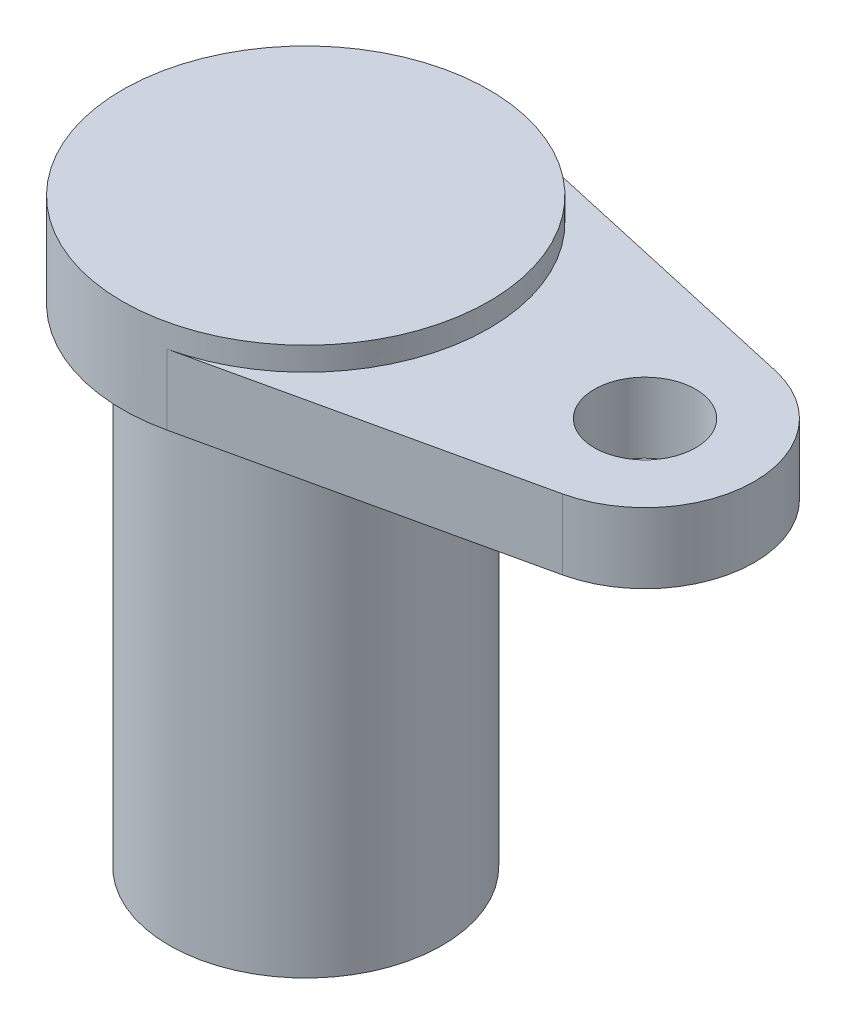
ISO-10303-21;
HEADER;
FILE_DESCRIPTION(('STEP AP214'),'2;1');
FILE_NAME('part.step','',(''),(''),'','','');
FILE_SCHEMA(('AUTOMOTIVE_DESIGN { 1 0 10303 214 1 1 1 1 }'));
ENDSEC;
DATA;
#1=APPLICATION_CONTEXT('core data for automotive mechanical design processes');
#2=APPLICATION_PROTOCOL_DEFINITION('international standard','automotive_design',2000,#1);
#3=PRODUCT_CONTEXT('',#1,'mechanical');
#4=PRODUCT('Part','Part','',(#3));
#5=PRODUCT_RELATED_PRODUCT_CATEGORY('part','',(#4));
#6=PRODUCT_DEFINITION_FORMATION('','',#4);
#7=PRODUCT_DEFINITION_CONTEXT('part definition',#1,'design');
#8=PRODUCT_DEFINITION('design','',#6,#7);
#9=PRODUCT_DEFINITION_SHAPE('','',#8);
#10=(LENGTH_UNIT() NAMED_UNIT(*) SI_UNIT(.MILLI.,.METRE.));
#11=(NAMED_UNIT(*) PLANE_ANGLE_UNIT() SI_UNIT($,.RADIAN.));
#12=(NAMED_UNIT(*) SI_UNIT($,.STERADIAN.) SOLID_ANGLE_UNIT());
#13=UNCERTAINTY_MEASURE_WITH_UNIT(LENGTH_MEASURE(1.E-05),#10,'distance_accuracy_value','');
#14=(GEOMETRIC_REPRESENTATION_CONTEXT(3) GLOBAL_UNCERTAINTY_ASSIGNED_CONTEXT((#13)) GLOBAL_UNIT_ASSIGNED_CONTEXT((#10,
#11,#12)) REPRESENTATION_CONTEXT('',''));
#15=CARTESIAN_POINT('',(0.,0.,0.));
#16=DIRECTION('',(0.,0.,1.));
#17=DIRECTION('',(1.,0.,0.));
#18=AXIS2_PLACEMENT_3D('',#15,#16,#17);
#19=CARTESIAN_POINT('',(0.,31.75,0.));
#20=DIRECTION('',(0.,-1.,0.));
#21=DIRECTION('',(0.,0.,-1.));
#22=AXIS2_PLACEMENT_3D('',#19,#20,#21);
#23=CYLINDRICAL_SURFACE('',#22,8.89);
#24=CARTESIAN_POINT('',(0.,31.75,0.));
#25=DIRECTION('',(0.,1.,0.));
#26=DIRECTION('',(0.,0.,1.));
#27=AXIS2_PLACEMENT_3D('',#24,#25,#26);
#28=CIRCLE('',#27,8.89);
#29=CARTESIAN_POINT('',(0.,31.75,8.89));
#30=VERTEX_POINT('',#29);
#31=EDGE_CURVE('E11',#30,#30,#28,.T.);
#32=ORIENTED_EDGE('',*,*,#31,.F.);
#33=EDGE_LOOP('',(#32));
#34=FACE_BOUND('',#33,.T.);
#35=CARTESIAN_POINT('',(0.,0.,0.));
#36=DIRECTION('',(0.,1.,0.));
#37=DIRECTION('',(0.,0.,1.));
#38=AXIS2_PLACEMENT_3D('',#35,#36,#37);
#39=CIRCLE('',#38,8.89);
#40=CARTESIAN_POINT('',(0.,0.,8.89));
#41=VERTEX_POINT('',#40);
#42=EDGE_CURVE('E52',#41,#41,#39,.T.);
#43=ORIENTED_EDGE('',*,*,#42,.T.);
#44=EDGE_LOOP('',(#43));
#45=FACE_BOUND('',#44,.T.);
#46=ADVANCED_FACE('F49',(#34,#45),#23,.T.);
#47=CARTESIAN_POINT('',(0.,0.,0.));
#48=DIRECTION('',(0.,1.,0.));
#49=DIRECTION('',(0.,0.,1.));
#50=AXIS2_PLACEMENT_3D('',#47,#48,#49);
#51=PLANE('',#50);
#52=ORIENTED_EDGE('',*,*,#42,.F.);
#53=EDGE_LOOP('',(#52));
#54=FACE_BOUND('',#53,.T.);
#55=ADVANCED_FACE('F179',(#54),#51,.F.);
#56=CARTESIAN_POINT('',(0.,36.322,0.));
#57=DIRECTION('',(0.,1.,0.));
#58=DIRECTION('',(0.,0.,1.));
#59=AXIS2_PLACEMENT_3D('',#56,#57,#58);
#60=PLANE('',#59);
#61=CARTESIAN_POINT('',(0.,36.322,0.));
#62=DIRECTION('',(0.,1.,0.));
#63=DIRECTION('',(0.,0.,1.));
#64=AXIS2_PLACEMENT_3D('',#61,#62,#63);
#65=CIRCLE('',#64,11.938);
#66=CARTESIAN_POINT('',(2.60714942528735,36.322,11.6498332981302));
#67=VERTEX_POINT('',#66);
#68=CARTESIAN_POINT('',(2.60714942528735,36.322,-11.6498332981302));
#69=VERTEX_POINT('',#68);
#70=EDGE_CURVE('E104',#67,#69,#65,.T.);
#71=ORIENTED_EDGE('',*,*,#70,.F.);
#72=DIRECTION('',(0.975861392036374,0.,-0.218390804597701));
#73=VECTOR('',#72,1.);
#74=CARTESIAN_POINT('',(23.6511954022988,36.322,6.94032622016269));
#75=LINE('',#74,#73);
#76=CARTESIAN_POINT('',(23.6511954022988,36.322,6.94032622016269));
#77=VERTEX_POINT('',#76);
#78=EDGE_CURVE('E93',#67,#77,#75,.T.);
#79=ORIENTED_EDGE('',*,*,#78,.T.);
#80=CARTESIAN_POINT('',(22.098,36.322,0.));
#81=DIRECTION('',(0.,1.,0.));
#82=DIRECTION('',(0.,0.,-1.));
#83=AXIS2_PLACEMENT_3D('',#80,#81,#82);
#84=CIRCLE('',#83,7.11200000000001);
#85=CARTESIAN_POINT('',(23.6511954022988,36.322,-6.9403262201627));
#86=VERTEX_POINT('',#85);
#87=EDGE_CURVE('E114',#77,#86,#84,.T.);
#88=ORIENTED_EDGE('',*,*,#87,.T.);
#89=DIRECTION('',(-0.975861392036374,0.,-0.218390804597701));
#90=VECTOR('',#89,1.);
#91=CARTESIAN_POINT('',(2.60714942528735,36.322,-11.6498332981302));
#92=LINE('',#91,#90);
#93=EDGE_CURVE('E66',#86,#69,#92,.T.);
#94=ORIENTED_EDGE('',*,*,#93,.T.);
#95=EDGE_LOOP('',(#71,#79,#88,#94));
#96=FACE_BOUND('',#95,.T.);
#97=CARTESIAN_POINT('',(22.098,36.322,0.));
#98=DIRECTION('',(0.,1.,0.));
#99=DIRECTION('',(0.,0.,1.));
#100=AXIS2_PLACEMENT_3D('',#97,#98,#99);
#101=CIRCLE('',#100,3.302);
#102=CARTESIAN_POINT('',(22.098,36.322,3.302));
#103=VERTEX_POINT('',#102);
#104=EDGE_CURVE('E126',#103,#103,#101,.T.);
#105=ORIENTED_EDGE('',*,*,#104,.F.);
#106=EDGE_LOOP('',(#105));
#107=FACE_BOUND('',#106,.T.);
#108=ADVANCED_FACE('F116',(#96,#107),#60,.T.);
#109=CARTESIAN_POINT('',(0.,31.75,0.));
#110=DIRECTION('',(0.,1.,0.));
#111=DIRECTION('',(0.,0.,1.));
#112=AXIS2_PLACEMENT_3D('',#109,#110,#111);
#113=PLANE('',#112);
#114=ORIENTED_EDGE('',*,*,#31,.T.);
#115=EDGE_LOOP('',(#114));
#116=FACE_BOUND('',#115,.T.);
#117=CARTESIAN_POINT('',(0.,31.75,0.));
#118=DIRECTION('',(0.,1.,0.));
#119=DIRECTION('',(0.,0.,1.));
#120=AXIS2_PLACEMENT_3D('',#117,#118,#119);
#121=CIRCLE('',#120,11.938);
#122=CARTESIAN_POINT('',(2.60714942528735,31.75,-11.6498332981302));
#123=VERTEX_POINT('',#122);
#124=CARTESIAN_POINT('',(2.60714942528735,31.75,11.6498332981302));
#125=VERTEX_POINT('',#124);
#126=EDGE_CURVE('E106',#123,#125,#121,.T.);
#127=ORIENTED_EDGE('',*,*,#126,.F.);
#128=DIRECTION('',(-0.975861392036374,0.,-0.218390804597701));
#129=VECTOR('',#128,1.);
#130=CARTESIAN_POINT('',(2.60714942528735,31.75,-11.6498332981302));
#131=LINE('',#130,#129);
#132=CARTESIAN_POINT('',(23.6511954022988,31.75,-6.9403262201627));
#133=VERTEX_POINT('',#132);
#134=EDGE_CURVE('E89',#133,#123,#131,.T.);
#135=ORIENTED_EDGE('',*,*,#134,.F.);
#136=CARTESIAN_POINT('',(22.098,31.75,0.));
#137=DIRECTION('',(0.,1.,0.));
#138=DIRECTION('',(0.,0.,-1.));
#139=AXIS2_PLACEMENT_3D('',#136,#137,#138);
#140=CIRCLE('',#139,7.11200000000001);
#141=CARTESIAN_POINT('',(23.6511954022988,31.75,6.94032622016269));
#142=VERTEX_POINT('',#141);
#143=EDGE_CURVE('E84',#142,#133,#140,.T.);
#144=ORIENTED_EDGE('',*,*,#143,.F.);
#145=DIRECTION('',(0.975861392036374,0.,-0.218390804597701));
#146=VECTOR('',#145,1.);
#147=CARTESIAN_POINT('',(23.6511954022988,31.75,6.94032622016269));
#148=LINE('',#147,#146);
#149=EDGE_CURVE('E140',#125,#142,#148,.T.);
#150=ORIENTED_EDGE('',*,*,#149,.F.);
#151=EDGE_LOOP('',(#127,#135,#144,#150));
#152=FACE_BOUND('',#151,.T.);
#153=CARTESIAN_POINT('',(22.098,31.75,0.));
#154=DIRECTION('',(0.,1.,0.));
#155=DIRECTION('',(0.,0.,1.));
#156=AXIS2_PLACEMENT_3D('',#153,#154,#155);
#157=CIRCLE('',#156,3.302);
#158=CARTESIAN_POINT('',(22.098,31.75,3.302));
#159=VERTEX_POINT('',#158);
#160=EDGE_CURVE('E123',#159,#159,#157,.T.);
#161=ORIENTED_EDGE('',*,*,#160,.T.);
#162=EDGE_LOOP('',(#161));
#163=FACE_BOUND('',#162,.T.);
#164=ADVANCED_FACE('F155',(#116,#152,#163),#113,.F.);
#165=CARTESIAN_POINT('',(0.,36.322,0.));
#166=DIRECTION('',(0.,-1.,0.));
#167=DIRECTION('',(0.,0.,-1.));
#168=AXIS2_PLACEMENT_3D('',#165,#166,#167);
#169=CYLINDRICAL_SURFACE('',#168,11.938);
#170=ORIENTED_EDGE('',*,*,#126,.T.);
#171=DIRECTION('',(0.,-1.,0.));
#172=VECTOR('',#171,1.);
#173=CARTESIAN_POINT('',(2.60714942528735,36.322,11.6498332981302));
#174=LINE('',#173,#172);
#175=EDGE_CURVE('E101',#67,#125,#174,.T.);
#176=ORIENTED_EDGE('',*,*,#175,.F.);
#177=ORIENTED_EDGE('',*,*,#70,.T.);
#178=DIRECTION('',(0.,-1.,0.));
#179=VECTOR('',#178,1.);
#180=CARTESIAN_POINT('',(2.60714942528735,36.322,-11.6498332981302));
#181=LINE('',#180,#179);
#182=EDGE_CURVE('E137',#69,#123,#181,.T.);
#183=ORIENTED_EDGE('',*,*,#182,.T.);
#184=EDGE_LOOP('',(#170,#176,#177,#183));
#185=FACE_BOUND('',#184,.T.);
#186=CARTESIAN_POINT('',(0.,37.846,0.));
#187=DIRECTION('',(0.,1.,0.));
#188=DIRECTION('',(0.,0.,1.));
#189=AXIS2_PLACEMENT_3D('',#186,#187,#188);
#190=CIRCLE('',#189,11.938);
#191=CARTESIAN_POINT('',(0.,37.846,11.938));
#192=VERTEX_POINT('',#191);
#193=EDGE_CURVE('E119',#192,#192,#190,.T.);
#194=ORIENTED_EDGE('',*,*,#193,.F.);
#195=EDGE_LOOP('',(#194));
#196=FACE_BOUND('',#195,.T.);
#197=ADVANCED_FACE('F102',(#185,#196),#169,.T.);
#198=CARTESIAN_POINT('',(23.6511954022988,36.322,6.94032622016269));
#199=DIRECTION('',(-0.218390804597701,0.,-0.975861392036374));
#200=DIRECTION('',(-0.975861392036374,0.,0.218390804597701));
#201=AXIS2_PLACEMENT_3D('',#198,#199,#200);
#202=PLANE('',#201);
#203=ORIENTED_EDGE('',*,*,#149,.T.);
#204=DIRECTION('',(0.,-1.,0.));
#205=VECTOR('',#204,1.);
#206=CARTESIAN_POINT('',(23.6511954022988,36.322,6.94032622016269));
#207=LINE('',#206,#205);
#208=EDGE_CURVE('E109',#77,#142,#207,.T.);
#209=ORIENTED_EDGE('',*,*,#208,.F.);
#210=ORIENTED_EDGE('',*,*,#78,.F.);
#211=ORIENTED_EDGE('',*,*,#175,.T.);
#212=EDGE_LOOP('',(#203,#209,#210,#211));
#213=FACE_BOUND('',#212,.T.);
#214=ADVANCED_FACE('F111',(#213),#202,.F.);
#215=CARTESIAN_POINT('',(22.098,36.322,0.));
#216=DIRECTION('',(0.,-1.,0.));
#217=DIRECTION('',(0.,0.,-1.));
#218=AXIS2_PLACEMENT_3D('',#215,#216,#217);
#219=CYLINDRICAL_SURFACE('',#218,7.11200000000001);
#220=ORIENTED_EDGE('',*,*,#143,.T.);
#221=DIRECTION('',(0.,-1.,0.));
#222=VECTOR('',#221,1.);
#223=CARTESIAN_POINT('',(23.6511954022988,36.322,-6.9403262201627));
#224=LINE('',#223,#222);
#225=EDGE_CURVE('E149',#86,#133,#224,.T.);
#226=ORIENTED_EDGE('',*,*,#225,.F.);
#227=ORIENTED_EDGE('',*,*,#87,.F.);
#228=ORIENTED_EDGE('',*,*,#208,.T.);
#229=EDGE_LOOP('',(#220,#226,#227,#228));
#230=FACE_BOUND('',#229,.T.);
#231=ADVANCED_FACE('F153',(#230),#219,.T.);
#232=CARTESIAN_POINT('',(2.60714942528735,36.322,-11.6498332981302));
#233=DIRECTION('',(-0.218390804597701,0.,0.975861392036374));
#234=DIRECTION('',(0.975861392036374,0.,0.218390804597701));
#235=AXIS2_PLACEMENT_3D('',#232,#233,#234);
#236=PLANE('',#235);
#237=ORIENTED_EDGE('',*,*,#134,.T.);
#238=ORIENTED_EDGE('',*,*,#182,.F.);
#239=ORIENTED_EDGE('',*,*,#93,.F.);
#240=ORIENTED_EDGE('',*,*,#225,.T.);
#241=EDGE_LOOP('',(#237,#238,#239,#240));
#242=FACE_BOUND('',#241,.T.);
#243=ADVANCED_FACE('F165',(#242),#236,.F.);
#244=CARTESIAN_POINT('',(22.098,36.322,0.));
#245=DIRECTION('',(0.,-1.,0.));
#246=DIRECTION('',(0.,0.,-1.));
#247=AXIS2_PLACEMENT_3D('',#244,#245,#246);
#248=CYLINDRICAL_SURFACE('',#247,3.302);
#249=ORIENTED_EDGE('',*,*,#104,.T.);
#250=EDGE_LOOP('',(#249));
#251=FACE_BOUND('',#250,.T.);
#252=ORIENTED_EDGE('',*,*,#160,.F.);
#253=EDGE_LOOP('',(#252));
#254=FACE_BOUND('',#253,.T.);
#255=ADVANCED_FACE('F162',(#251,#254),#248,.F.);
#256=CARTESIAN_POINT('',(0.,37.846,0.));
#257=DIRECTION('',(0.,1.,0.));
#258=DIRECTION('',(0.,0.,1.));
#259=AXIS2_PLACEMENT_3D('',#256,#257,#258);
#260=PLANE('',#259);
#261=ORIENTED_EDGE('',*,*,#193,.T.);
#262=EDGE_LOOP('',(#261));
#263=FACE_BOUND('',#262,.T.);
#264=ADVANCED_FACE('F164',(#263),#260,.T.);
#265=CLOSED_SHELL('',(#46,#55,#108,#164,#197,#214,#231,#243,#255,#264));
#266=MANIFOLD_SOLID_BREP('B2',#265);
#267=ADVANCED_BREP_SHAPE_REPRESENTATION('',(#18,#266),#14);
#268=SHAPE_DEFINITION_REPRESENTATION(#9,#267);
ENDSEC;
END-ISO-10303-21;
